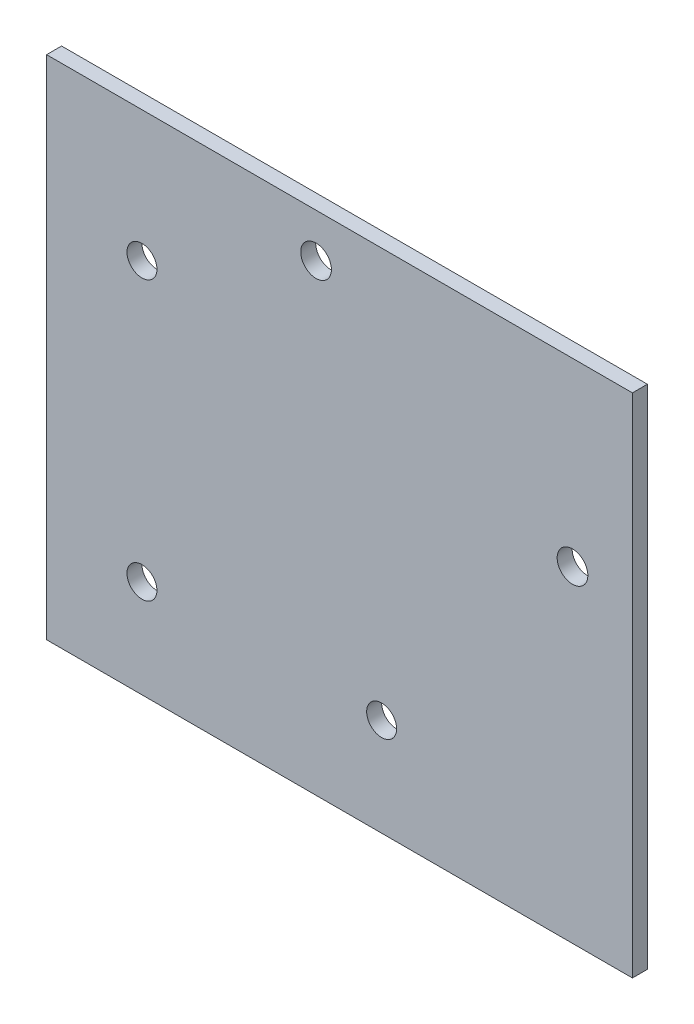
ISO-10303-21;
HEADER;
FILE_DESCRIPTION(('STEP AP214'),'2;1');
FILE_NAME('part.step','',(''),(''),'','','');
FILE_SCHEMA(('AUTOMOTIVE_DESIGN { 1 0 10303 214 1 1 1 1 }'));
ENDSEC;
DATA;
#1=APPLICATION_CONTEXT('core data for automotive mechanical design processes');
#2=APPLICATION_PROTOCOL_DEFINITION('international standard','automotive_design',2000,#1);
#3=PRODUCT_CONTEXT('',#1,'mechanical');
#4=PRODUCT('Part','Part','',(#3));
#5=PRODUCT_RELATED_PRODUCT_CATEGORY('part','',(#4));
#6=PRODUCT_DEFINITION_FORMATION('','',#4);
#7=PRODUCT_DEFINITION_CONTEXT('part definition',#1,'design');
#8=PRODUCT_DEFINITION('design','',#6,#7);
#9=PRODUCT_DEFINITION_SHAPE('','',#8);
#10=(LENGTH_UNIT() NAMED_UNIT(*) SI_UNIT(.MILLI.,.METRE.));
#11=(NAMED_UNIT(*) PLANE_ANGLE_UNIT() SI_UNIT($,.RADIAN.));
#12=(NAMED_UNIT(*) SI_UNIT($,.STERADIAN.) SOLID_ANGLE_UNIT());
#13=UNCERTAINTY_MEASURE_WITH_UNIT(LENGTH_MEASURE(1.E-05),#10,'distance_accuracy_value','');
#14=(GEOMETRIC_REPRESENTATION_CONTEXT(3) GLOBAL_UNCERTAINTY_ASSIGNED_CONTEXT((#13)) GLOBAL_UNIT_ASSIGNED_CONTEXT((#10,
#11,#12)) REPRESENTATION_CONTEXT('',''));
#15=CARTESIAN_POINT('',(0.,0.,0.));
#16=DIRECTION('',(0.,0.,1.));
#17=DIRECTION('',(1.,0.,0.));
#18=AXIS2_PLACEMENT_3D('',#15,#16,#17);
#19=CARTESIAN_POINT('',(0.,0.,3.175));
#20=DIRECTION('',(0.,0.,-1.));
#21=DIRECTION('',(-1.,0.,0.));
#22=AXIS2_PLACEMENT_3D('',#19,#20,#21);
#23=PLANE('',#22);
#24=DIRECTION('',(0.,1.,0.));
#25=VECTOR('',#24,1.);
#26=CARTESIAN_POINT('',(129.358054974716,204.605280267344,3.175));
#27=LINE('',#26,#25);
#28=CARTESIAN_POINT('',(129.358054974716,97.1939454692005,3.175));
#29=VERTEX_POINT('',#28);
#30=CARTESIAN_POINT('',(129.358054974716,204.605280267344,3.175));
#31=VERTEX_POINT('',#30);
#32=EDGE_CURVE('E100',#29,#31,#27,.T.);
#33=ORIENTED_EDGE('',*,*,#32,.T.);
#34=DIRECTION('',(-1.,0.,0.));
#35=VECTOR('',#34,1.);
#36=CARTESIAN_POINT('',(129.358054974716,204.605280267344,3.175));
#37=LINE('',#36,#35);
#38=CARTESIAN_POINT('',(5.18721183755132,204.605280267344,3.175));
#39=VERTEX_POINT('',#38);
#40=EDGE_CURVE('E95',#31,#39,#37,.T.);
#41=ORIENTED_EDGE('',*,*,#40,.T.);
#42=DIRECTION('',(0.,-1.,0.));
#43=VECTOR('',#42,1.);
#44=CARTESIAN_POINT('',(5.18721183755132,204.605280267344,3.175));
#45=LINE('',#44,#43);
#46=CARTESIAN_POINT('',(5.18721183755133,97.1939454692006,3.175));
#47=VERTEX_POINT('',#46);
#48=EDGE_CURVE('E98',#39,#47,#45,.T.);
#49=ORIENTED_EDGE('',*,*,#48,.T.);
#50=DIRECTION('',(1.,0.,0.));
#51=VECTOR('',#50,1.);
#52=CARTESIAN_POINT('',(129.358054974716,97.1939454692005,3.175));
#53=LINE('',#52,#51);
#54=EDGE_CURVE('E65',#47,#29,#53,.T.);
#55=ORIENTED_EDGE('',*,*,#54,.T.);
#56=EDGE_LOOP('',(#33,#41,#49,#55));
#57=FACE_BOUND('',#56,.T.);
#58=CARTESIAN_POINT('',(25.3999999999996,117.928571428571,3.175));
#59=DIRECTION('',(0.,0.,1.));
#60=DIRECTION('',(1.,0.,0.));
#61=AXIS2_PLACEMENT_3D('',#58,#59,#60);
#62=CIRCLE('',#61,3.17499999999999);
#63=CARTESIAN_POINT('',(28.5749999999996,117.928571428571,3.175));
#64=VERTEX_POINT('',#63);
#65=EDGE_CURVE('E122',#64,#64,#62,.T.);
#66=ORIENTED_EDGE('',*,*,#65,.F.);
#67=EDGE_LOOP('',(#66));
#68=FACE_BOUND('',#67,.T.);
#69=CARTESIAN_POINT('',(25.3999999999994,176.892857142857,3.175));
#70=DIRECTION('',(0.,0.,1.));
#71=DIRECTION('',(1.,0.,0.));
#72=AXIS2_PLACEMENT_3D('',#69,#70,#71);
#73=CIRCLE('',#72,3.17500000000001);
#74=CARTESIAN_POINT('',(28.5749999999994,176.892857142857,3.175));
#75=VERTEX_POINT('',#74);
#76=EDGE_CURVE('E148',#75,#75,#73,.T.);
#77=ORIENTED_EDGE('',*,*,#76,.F.);
#78=EDGE_LOOP('',(#77));
#79=FACE_BOUND('',#78,.T.);
#80=CARTESIAN_POINT('',(76.1999999999996,117.928571428572,3.175));
#81=DIRECTION('',(0.,0.,1.));
#82=DIRECTION('',(1.,0.,0.));
#83=AXIS2_PLACEMENT_3D('',#80,#81,#82);
#84=CIRCLE('',#83,3.175);
#85=CARTESIAN_POINT('',(79.3749999999996,117.928571428572,3.175));
#86=VERTEX_POINT('',#85);
#87=EDGE_CURVE('E156',#86,#86,#84,.T.);
#88=ORIENTED_EDGE('',*,*,#87,.F.);
#89=EDGE_LOOP('',(#88));
#90=FACE_BOUND('',#89,.T.);
#91=CARTESIAN_POINT('',(116.658054974716,166.37,3.175));
#92=DIRECTION('',(0.,0.,1.));
#93=DIRECTION('',(1.,0.,0.));
#94=AXIS2_PLACEMENT_3D('',#91,#92,#93);
#95=CIRCLE('',#94,3.25119999999999);
#96=CARTESIAN_POINT('',(119.909254974716,166.37,3.175));
#97=VERTEX_POINT('',#96);
#98=EDGE_CURVE('E164',#97,#97,#95,.T.);
#99=ORIENTED_EDGE('',*,*,#98,.F.);
#100=EDGE_LOOP('',(#99));
#101=FACE_BOUND('',#100,.T.);
#102=CARTESIAN_POINT('',(62.3020549747163,195.326,3.175));
#103=DIRECTION('',(0.,0.,1.));
#104=DIRECTION('',(1.,0.,0.));
#105=AXIS2_PLACEMENT_3D('',#102,#103,#104);
#106=CIRCLE('',#105,3.25119999999998);
#107=CARTESIAN_POINT('',(65.5532549747163,195.326,3.175));
#108=VERTEX_POINT('',#107);
#109=EDGE_CURVE('E172',#108,#108,#106,.T.);
#110=ORIENTED_EDGE('',*,*,#109,.F.);
#111=EDGE_LOOP('',(#110));
#112=FACE_BOUND('',#111,.T.);
#113=ADVANCED_FACE('F47',(#57,#68,#79,#90,#101,#112),#23,.F.);
#114=CARTESIAN_POINT('',(0.,0.,0.));
#115=DIRECTION('',(0.,0.,-1.));
#116=DIRECTION('',(-1.,0.,0.));
#117=AXIS2_PLACEMENT_3D('',#114,#115,#116);
#118=PLANE('',#117);
#119=CARTESIAN_POINT('',(116.658054974716,166.37,0.));
#120=DIRECTION('',(0.,0.,1.));
#121=DIRECTION('',(1.,0.,0.));
#122=AXIS2_PLACEMENT_3D('',#119,#120,#121);
#123=CIRCLE('',#122,3.25119999999999);
#124=CARTESIAN_POINT('',(119.909254974716,166.37,0.));
#125=VERTEX_POINT('',#124);
#126=EDGE_CURVE('E168',#125,#125,#123,.T.);
#127=ORIENTED_EDGE('',*,*,#126,.T.);
#128=EDGE_LOOP('',(#127));
#129=FACE_BOUND('',#128,.T.);
#130=CARTESIAN_POINT('',(25.3999999999994,176.892857142857,0.));
#131=DIRECTION('',(0.,0.,1.));
#132=DIRECTION('',(1.,0.,0.));
#133=AXIS2_PLACEMENT_3D('',#130,#131,#132);
#134=CIRCLE('',#133,3.17500000000001);
#135=CARTESIAN_POINT('',(28.5749999999994,176.892857142857,0.));
#136=VERTEX_POINT('',#135);
#137=EDGE_CURVE('E152',#136,#136,#134,.T.);
#138=ORIENTED_EDGE('',*,*,#137,.T.);
#139=EDGE_LOOP('',(#138));
#140=FACE_BOUND('',#139,.T.);
#141=DIRECTION('',(0.,1.,0.));
#142=VECTOR('',#141,1.);
#143=CARTESIAN_POINT('',(129.358054974716,204.605280267344,0.));
#144=LINE('',#143,#142);
#145=CARTESIAN_POINT('',(129.358054974716,97.1939454692005,0.));
#146=VERTEX_POINT('',#145);
#147=CARTESIAN_POINT('',(129.358054974716,204.605280267344,0.));
#148=VERTEX_POINT('',#147);
#149=EDGE_CURVE('E118',#146,#148,#144,.T.);
#150=ORIENTED_EDGE('',*,*,#149,.F.);
#151=DIRECTION('',(1.,0.,0.));
#152=VECTOR('',#151,1.);
#153=CARTESIAN_POINT('',(129.358054974716,97.1939454692005,0.));
#154=LINE('',#153,#152);
#155=CARTESIAN_POINT('',(5.18721183755133,97.1939454692006,0.));
#156=VERTEX_POINT('',#155);
#157=EDGE_CURVE('E88',#156,#146,#154,.T.);
#158=ORIENTED_EDGE('',*,*,#157,.F.);
#159=DIRECTION('',(0.,-1.,0.));
#160=VECTOR('',#159,1.);
#161=CARTESIAN_POINT('',(5.18721183755132,204.605280267344,0.));
#162=LINE('',#161,#160);
#163=CARTESIAN_POINT('',(5.18721183755132,204.605280267344,0.));
#164=VERTEX_POINT('',#163);
#165=EDGE_CURVE('E82',#164,#156,#162,.T.);
#166=ORIENTED_EDGE('',*,*,#165,.F.);
#167=DIRECTION('',(-1.,0.,0.));
#168=VECTOR('',#167,1.);
#169=CARTESIAN_POINT('',(129.358054974716,204.605280267344,0.));
#170=LINE('',#169,#168);
#171=EDGE_CURVE('E105',#148,#164,#170,.T.);
#172=ORIENTED_EDGE('',*,*,#171,.F.);
#173=EDGE_LOOP('',(#150,#158,#166,#172));
#174=FACE_BOUND('',#173,.T.);
#175=CARTESIAN_POINT('',(25.3999999999996,117.928571428571,0.));
#176=DIRECTION('',(0.,0.,1.));
#177=DIRECTION('',(1.,0.,0.));
#178=AXIS2_PLACEMENT_3D('',#175,#176,#177);
#179=CIRCLE('',#178,3.17499999999999);
#180=CARTESIAN_POINT('',(28.5749999999996,117.928571428571,0.));
#181=VERTEX_POINT('',#180);
#182=EDGE_CURVE('E144',#181,#181,#179,.T.);
#183=ORIENTED_EDGE('',*,*,#182,.T.);
#184=EDGE_LOOP('',(#183));
#185=FACE_BOUND('',#184,.T.);
#186=CARTESIAN_POINT('',(76.1999999999996,117.928571428572,0.));
#187=DIRECTION('',(0.,0.,1.));
#188=DIRECTION('',(1.,0.,0.));
#189=AXIS2_PLACEMENT_3D('',#186,#187,#188);
#190=CIRCLE('',#189,3.175);
#191=CARTESIAN_POINT('',(79.3749999999996,117.928571428572,0.));
#192=VERTEX_POINT('',#191);
#193=EDGE_CURVE('E160',#192,#192,#190,.T.);
#194=ORIENTED_EDGE('',*,*,#193,.T.);
#195=EDGE_LOOP('',(#194));
#196=FACE_BOUND('',#195,.T.);
#197=CARTESIAN_POINT('',(62.3020549747163,195.326,0.));
#198=DIRECTION('',(0.,0.,1.));
#199=DIRECTION('',(1.,0.,0.));
#200=AXIS2_PLACEMENT_3D('',#197,#198,#199);
#201=CIRCLE('',#200,3.25119999999998);
#202=CARTESIAN_POINT('',(65.5532549747163,195.326,0.));
#203=VERTEX_POINT('',#202);
#204=EDGE_CURVE('E176',#203,#203,#201,.T.);
#205=ORIENTED_EDGE('',*,*,#204,.T.);
#206=EDGE_LOOP('',(#205));
#207=FACE_BOUND('',#206,.T.);
#208=ADVANCED_FACE('F137',(#129,#140,#174,#185,#196,#207),#118,.T.);
#209=CARTESIAN_POINT('',(129.358054974716,204.605280267344,3.175));
#210=DIRECTION('',(-1.,0.,0.));
#211=DIRECTION('',(0.,-1.,0.));
#212=AXIS2_PLACEMENT_3D('',#209,#210,#211);
#213=PLANE('',#212);
#214=ORIENTED_EDGE('',*,*,#149,.T.);
#215=DIRECTION('',(0.,0.,-1.));
#216=VECTOR('',#215,1.);
#217=CARTESIAN_POINT('',(129.358054974716,204.605280267344,3.175));
#218=LINE('',#217,#216);
#219=EDGE_CURVE('E11',#31,#148,#218,.T.);
#220=ORIENTED_EDGE('',*,*,#219,.F.);
#221=ORIENTED_EDGE('',*,*,#32,.F.);
#222=DIRECTION('',(0.,0.,-1.));
#223=VECTOR('',#222,1.);
#224=CARTESIAN_POINT('',(129.358054974716,97.1939454692005,3.175));
#225=LINE('',#224,#223);
#226=EDGE_CURVE('E114',#29,#146,#225,.T.);
#227=ORIENTED_EDGE('',*,*,#226,.T.);
#228=EDGE_LOOP('',(#214,#220,#221,#227));
#229=FACE_BOUND('',#228,.T.);
#230=ADVANCED_FACE('F49',(#229),#213,.F.);
#231=CARTESIAN_POINT('',(129.358054974716,204.605280267344,3.175));
#232=DIRECTION('',(0.,-1.,0.));
#233=DIRECTION('',(0.,0.,-1.));
#234=AXIS2_PLACEMENT_3D('',#231,#232,#233);
#235=PLANE('',#234);
#236=ORIENTED_EDGE('',*,*,#171,.T.);
#237=DIRECTION('',(0.,0.,-1.));
#238=VECTOR('',#237,1.);
#239=CARTESIAN_POINT('',(5.18721183755132,204.605280267344,3.175));
#240=LINE('',#239,#238);
#241=EDGE_CURVE('E57',#39,#164,#240,.T.);
#242=ORIENTED_EDGE('',*,*,#241,.F.);
#243=ORIENTED_EDGE('',*,*,#40,.F.);
#244=ORIENTED_EDGE('',*,*,#219,.T.);
#245=EDGE_LOOP('',(#236,#242,#243,#244));
#246=FACE_BOUND('',#245,.T.);
#247=ADVANCED_FACE('F104',(#246),#235,.F.);
#248=CARTESIAN_POINT('',(5.18721183755132,204.605280267344,3.175));
#249=DIRECTION('',(1.,0.,0.));
#250=DIRECTION('',(0.,1.,0.));
#251=AXIS2_PLACEMENT_3D('',#248,#249,#250);
#252=PLANE('',#251);
#253=ORIENTED_EDGE('',*,*,#165,.T.);
#254=DIRECTION('',(0.,0.,-1.));
#255=VECTOR('',#254,1.);
#256=CARTESIAN_POINT('',(5.18721183755133,97.1939454692006,3.175));
#257=LINE('',#256,#255);
#258=EDGE_CURVE('E107',#47,#156,#257,.T.);
#259=ORIENTED_EDGE('',*,*,#258,.F.);
#260=ORIENTED_EDGE('',*,*,#48,.F.);
#261=ORIENTED_EDGE('',*,*,#241,.T.);
#262=EDGE_LOOP('',(#253,#259,#260,#261));
#263=FACE_BOUND('',#262,.T.);
#264=ADVANCED_FACE('F108',(#263),#252,.F.);
#265=CARTESIAN_POINT('',(129.358054974716,97.1939454692005,3.175));
#266=DIRECTION('',(0.,1.,0.));
#267=DIRECTION('',(-1.,0.,0.));
#268=AXIS2_PLACEMENT_3D('',#265,#266,#267);
#269=PLANE('',#268);
#270=ORIENTED_EDGE('',*,*,#157,.T.);
#271=ORIENTED_EDGE('',*,*,#226,.F.);
#272=ORIENTED_EDGE('',*,*,#54,.F.);
#273=ORIENTED_EDGE('',*,*,#258,.T.);
#274=EDGE_LOOP('',(#270,#271,#272,#273));
#275=FACE_BOUND('',#274,.T.);
#276=ADVANCED_FACE('F134',(#275),#269,.F.);
#277=CARTESIAN_POINT('',(25.3999999999996,117.928571428571,3.175));
#278=DIRECTION('',(0.,0.,-1.));
#279=DIRECTION('',(-1.,0.,0.));
#280=AXIS2_PLACEMENT_3D('',#277,#278,#279);
#281=CYLINDRICAL_SURFACE('',#280,3.17499999999999);
#282=ORIENTED_EDGE('',*,*,#65,.T.);
#283=EDGE_LOOP('',(#282));
#284=FACE_BOUND('',#283,.T.);
#285=ORIENTED_EDGE('',*,*,#182,.F.);
#286=EDGE_LOOP('',(#285));
#287=FACE_BOUND('',#286,.T.);
#288=ADVANCED_FACE('F197',(#284,#287),#281,.F.);
#289=CARTESIAN_POINT('',(25.3999999999994,176.892857142857,3.175));
#290=DIRECTION('',(0.,0.,-1.));
#291=DIRECTION('',(-1.,0.,0.));
#292=AXIS2_PLACEMENT_3D('',#289,#290,#291);
#293=CYLINDRICAL_SURFACE('',#292,3.17500000000001);
#294=ORIENTED_EDGE('',*,*,#76,.T.);
#295=EDGE_LOOP('',(#294));
#296=FACE_BOUND('',#295,.T.);
#297=ORIENTED_EDGE('',*,*,#137,.F.);
#298=EDGE_LOOP('',(#297));
#299=FACE_BOUND('',#298,.T.);
#300=ADVANCED_FACE('F265',(#296,#299),#293,.F.);
#301=CARTESIAN_POINT('',(76.1999999999996,117.928571428572,3.175));
#302=DIRECTION('',(0.,0.,-1.));
#303=DIRECTION('',(-1.,0.,0.));
#304=AXIS2_PLACEMENT_3D('',#301,#302,#303);
#305=CYLINDRICAL_SURFACE('',#304,3.175);
#306=ORIENTED_EDGE('',*,*,#87,.T.);
#307=EDGE_LOOP('',(#306));
#308=FACE_BOUND('',#307,.T.);
#309=ORIENTED_EDGE('',*,*,#193,.F.);
#310=EDGE_LOOP('',(#309));
#311=FACE_BOUND('',#310,.T.);
#312=ADVANCED_FACE('F276',(#308,#311),#305,.F.);
#313=CARTESIAN_POINT('',(116.658054974716,166.37,3.175));
#314=DIRECTION('',(0.,0.,-1.));
#315=DIRECTION('',(-1.,0.,0.));
#316=AXIS2_PLACEMENT_3D('',#313,#314,#315);
#317=CYLINDRICAL_SURFACE('',#316,3.25119999999999);
#318=ORIENTED_EDGE('',*,*,#98,.T.);
#319=EDGE_LOOP('',(#318));
#320=FACE_BOUND('',#319,.T.);
#321=ORIENTED_EDGE('',*,*,#126,.F.);
#322=EDGE_LOOP('',(#321));
#323=FACE_BOUND('',#322,.T.);
#324=ADVANCED_FACE('F287',(#320,#323),#317,.F.);
#325=CARTESIAN_POINT('',(62.3020549747163,195.326,3.175));
#326=DIRECTION('',(0.,0.,-1.));
#327=DIRECTION('',(-1.,0.,0.));
#328=AXIS2_PLACEMENT_3D('',#325,#326,#327);
#329=CYLINDRICAL_SURFACE('',#328,3.25119999999998);
#330=ORIENTED_EDGE('',*,*,#109,.T.);
#331=EDGE_LOOP('',(#330));
#332=FACE_BOUND('',#331,.T.);
#333=ORIENTED_EDGE('',*,*,#204,.F.);
#334=EDGE_LOOP('',(#333));
#335=FACE_BOUND('',#334,.T.);
#336=ADVANCED_FACE('F186',(#332,#335),#329,.F.);
#337=CLOSED_SHELL('',(#113,#208,#230,#247,#264,#276,#288,#300,#312,#324,#336));
#338=MANIFOLD_SOLID_BREP('B2',#337);
#339=ADVANCED_BREP_SHAPE_REPRESENTATION('',(#18,#338),#14);
#340=SHAPE_DEFINITION_REPRESENTATION(#9,#339);
ENDSEC;
END-ISO-10303-21;
